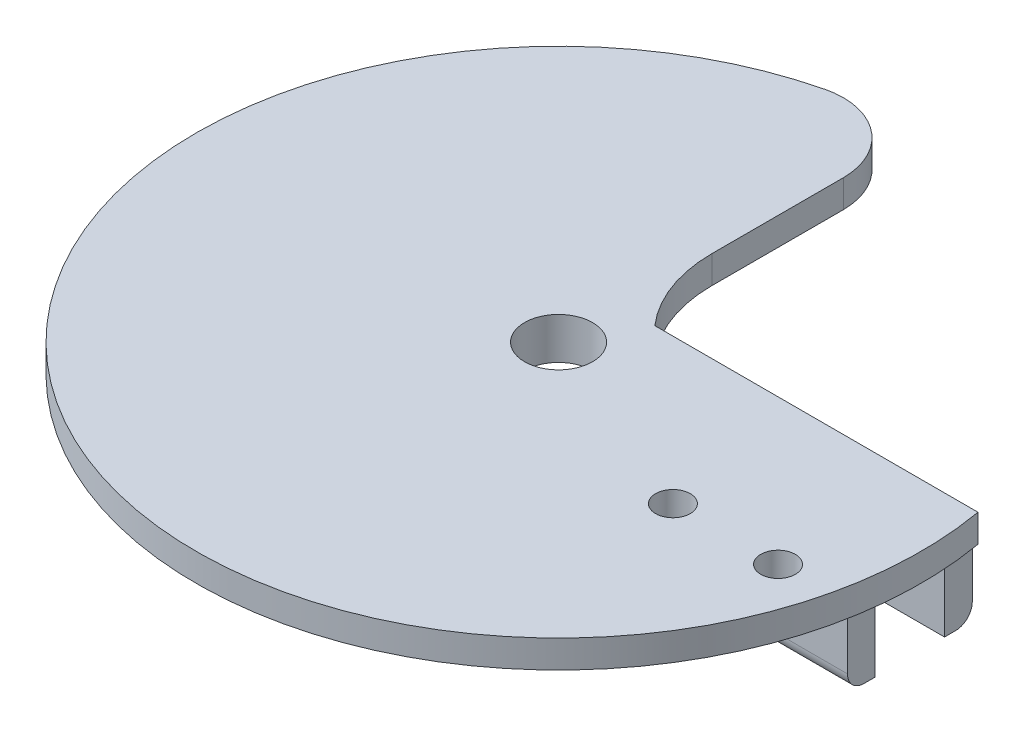
ISO-10303-21;
HEADER;
FILE_DESCRIPTION(('STEP AP214'),'2;1');
FILE_NAME('part.step','',(''),(''),'','','');
FILE_SCHEMA(('AUTOMOTIVE_DESIGN { 1 0 10303 214 1 1 1 1 }'));
ENDSEC;
DATA;
#1=APPLICATION_CONTEXT('core data for automotive mechanical design processes');
#2=APPLICATION_PROTOCOL_DEFINITION('international standard','automotive_design',2000,#1);
#3=PRODUCT_CONTEXT('',#1,'mechanical');
#4=PRODUCT('Part','Part','',(#3));
#5=PRODUCT_RELATED_PRODUCT_CATEGORY('part','',(#4));
#6=PRODUCT_DEFINITION_FORMATION('','',#4);
#7=PRODUCT_DEFINITION_CONTEXT('part definition',#1,'design');
#8=PRODUCT_DEFINITION('design','',#6,#7);
#9=PRODUCT_DEFINITION_SHAPE('','',#8);
#10=(LENGTH_UNIT() NAMED_UNIT(*) SI_UNIT(.MILLI.,.METRE.));
#11=(NAMED_UNIT(*) PLANE_ANGLE_UNIT() SI_UNIT($,.RADIAN.));
#12=(NAMED_UNIT(*) SI_UNIT($,.STERADIAN.) SOLID_ANGLE_UNIT());
#13=UNCERTAINTY_MEASURE_WITH_UNIT(LENGTH_MEASURE(1.E-05),#10,'distance_accuracy_value','');
#14=(GEOMETRIC_REPRESENTATION_CONTEXT(3) GLOBAL_UNCERTAINTY_ASSIGNED_CONTEXT((#13)) GLOBAL_UNIT_ASSIGNED_CONTEXT((#10,
#11,#12)) REPRESENTATION_CONTEXT('',''));
#15=CARTESIAN_POINT('',(0.,0.,0.));
#16=DIRECTION('',(0.,0.,1.));
#17=DIRECTION('',(1.,0.,0.));
#18=AXIS2_PLACEMENT_3D('',#15,#16,#17);
#19=CARTESIAN_POINT('',(0.,-2.,0.));
#20=DIRECTION('',(0.,1.,0.));
#21=DIRECTION('',(0.,0.,1.));
#22=AXIS2_PLACEMENT_3D('',#19,#20,#21);
#23=PLANE('',#22);
#24=DIRECTION('',(-1.,0.,0.));
#25=VECTOR('',#24,1.);
#26=CARTESIAN_POINT('',(0.,-2.,-4.5));
#27=LINE('',#26,#25);
#28=CARTESIAN_POINT('',(11.8896855897017,-2.,-4.5));
#29=VERTEX_POINT('',#28);
#30=CARTESIAN_POINT('',(2.44008444625373,-2.,-4.5));
#31=VERTEX_POINT('',#30);
#32=EDGE_CURVE('E270',#29,#31,#27,.T.);
#33=ORIENTED_EDGE('',*,*,#32,.F.);
#34=DIRECTION('',(0.,0.,1.));
#35=VECTOR('',#34,1.);
#36=CARTESIAN_POINT('',(11.8896855897017,-2.,0.));
#37=LINE('',#36,#35);
#38=CARTESIAN_POINT('',(11.8896855897017,-2.,-2.5));
#39=VERTEX_POINT('',#38);
#40=EDGE_CURVE('E305',#29,#39,#37,.T.);
#41=ORIENTED_EDGE('',*,*,#40,.T.);
#42=DIRECTION('',(1.,0.,0.));
#43=VECTOR('',#42,1.);
#44=CARTESIAN_POINT('',(0.,-2.,-2.5));
#45=LINE('',#44,#43);
#46=CARTESIAN_POINT('',(25.3293086999187,-2.,-2.5));
#47=VERTEX_POINT('',#46);
#48=EDGE_CURVE('E308',#39,#47,#45,.T.);
#49=ORIENTED_EDGE('',*,*,#48,.T.);
#50=DIRECTION('',(0.,0.,1.));
#51=VECTOR('',#50,1.);
#52=CARTESIAN_POINT('',(25.3293086999187,-2.,0.));
#53=LINE('',#52,#51);
#54=CARTESIAN_POINT('',(25.3293086999187,-2.,-4.5));
#55=VERTEX_POINT('',#54);
#56=EDGE_CURVE('E311',#55,#47,#53,.T.);
#57=ORIENTED_EDGE('',*,*,#56,.F.);
#58=CARTESIAN_POINT('',(25.7422891993278,-2.,-4.5));
#59=VERTEX_POINT('',#58);
#60=EDGE_CURVE('E272',#59,#55,#27,.T.);
#61=ORIENTED_EDGE('',*,*,#60,.F.);
#62=CARTESIAN_POINT('',(0.,-2.,0.));
#63=DIRECTION('',(0.,1.,0.));
#64=DIRECTION('',(0.,0.,1.));
#65=AXIS2_PLACEMENT_3D('',#62,#63,#64);
#66=CIRCLE('',#65,26.1326510944035);
#67=CARTESIAN_POINT('',(-6.18300349011207,-2.,-25.39066602244));
#68=VERTEX_POINT('',#67);
#69=EDGE_CURVE('E268',#68,#59,#66,.T.);
#70=ORIENTED_EDGE('',*,*,#69,.F.);
#71=CARTESIAN_POINT('',(-5.,-2.,-20.5326311581783));
#72=DIRECTION('',(0.,1.,0.));
#73=DIRECTION('',(0.,0.,1.));
#74=AXIS2_PLACEMENT_3D('',#71,#72,#73);
#75=CIRCLE('',#74,5.);
#76=CARTESIAN_POINT('',(0.,-2.,-20.5326311581783));
#77=VERTEX_POINT('',#76);
#78=EDGE_CURVE('E332',#68,#77,#75,.F.);
#79=ORIENTED_EDGE('',*,*,#78,.T.);
#80=DIRECTION('',(0.,0.,-1.));
#81=VECTOR('',#80,1.);
#82=CARTESIAN_POINT('',(0.,-2.,0.));
#83=LINE('',#82,#81);
#84=CARTESIAN_POINT('',(0.,-2.,-11.0458136866417));
#85=VERTEX_POINT('',#84);
#86=EDGE_CURVE('E275',#85,#77,#83,.T.);
#87=ORIENTED_EDGE('',*,*,#86,.F.);
#88=CARTESIAN_POINT('',(10.,-2.,-11.0458136866417));
#89=DIRECTION('',(0.,1.,0.));
#90=DIRECTION('',(0.,0.,1.));
#91=AXIS2_PLACEMENT_3D('',#88,#89,#90);
#92=CIRCLE('',#91,10.);
#93=EDGE_CURVE('E323',#85,#31,#92,.T.);
#94=ORIENTED_EDGE('',*,*,#93,.T.);
#95=EDGE_LOOP('',(#33,#41,#49,#57,#61,#70,#79,#87,#94));
#96=FACE_BOUND('',#95,.T.);
#97=CARTESIAN_POINT('',(0.,-2.,0.));
#98=DIRECTION('',(0.,1.,0.));
#99=DIRECTION('',(0.,0.,1.));
#100=AXIS2_PLACEMENT_3D('',#97,#98,#99);
#101=CIRCLE('',#100,4.9);
#102=CARTESIAN_POINT('',(3.28859060402685,-2.,-3.63251591037209));
#103=VERTEX_POINT('',#102);
#104=EDGE_CURVE('E300',#103,#103,#101,.T.);
#105=ORIENTED_EDGE('',*,*,#104,.T.);
#106=EDGE_LOOP('',(#105));
#107=FACE_BOUND('',#106,.T.);
#108=CARTESIAN_POINT('',(21.7862693163227,-2.,5.96189289697691));
#109=DIRECTION('',(0.,1.,0.));
#110=DIRECTION('',(0.,0.,1.));
#111=AXIS2_PLACEMENT_3D('',#108,#109,#110);
#112=CIRCLE('',#111,1.25);
#113=CARTESIAN_POINT('',(21.7862693163227,-2.,7.21189289697691));
#114=VERTEX_POINT('',#113);
#115=EDGE_CURVE('E278',#114,#114,#112,.T.);
#116=ORIENTED_EDGE('',*,*,#115,.T.);
#117=EDGE_LOOP('',(#116));
#118=FACE_BOUND('',#117,.T.);
#119=CARTESIAN_POINT('',(14.2060577810632,-2.,5.96189289697691));
#120=DIRECTION('',(0.,1.,0.));
#121=DIRECTION('',(0.,0.,1.));
#122=AXIS2_PLACEMENT_3D('',#119,#120,#121);
#123=CIRCLE('',#122,1.25);
#124=CARTESIAN_POINT('',(14.2060577810632,-2.,7.2118928969769));
#125=VERTEX_POINT('',#124);
#126=EDGE_CURVE('E281',#125,#125,#123,.T.);
#127=ORIENTED_EDGE('',*,*,#126,.T.);
#128=EDGE_LOOP('',(#127));
#129=FACE_BOUND('',#128,.T.);
#130=DIRECTION('',(0.,0.,1.));
#131=VECTOR('',#130,1.);
#132=CARTESIAN_POINT('',(25.3293086999187,-2.,0.));
#133=LINE('',#132,#131);
#134=CARTESIAN_POINT('',(25.3293086999187,-2.,2.5));
#135=VERTEX_POINT('',#134);
#136=CARTESIAN_POINT('',(25.3293086999187,-2.,4.5));
#137=VERTEX_POINT('',#136);
#138=EDGE_CURVE('E242',#135,#137,#133,.T.);
#139=ORIENTED_EDGE('',*,*,#138,.F.);
#140=DIRECTION('',(1.,0.,0.));
#141=VECTOR('',#140,1.);
#142=CARTESIAN_POINT('',(0.,-2.,2.5));
#143=LINE('',#142,#141);
#144=CARTESIAN_POINT('',(11.8896855897017,-2.,2.5));
#145=VERTEX_POINT('',#144);
#146=EDGE_CURVE('E219',#145,#135,#143,.T.);
#147=ORIENTED_EDGE('',*,*,#146,.F.);
#148=DIRECTION('',(0.,0.,1.));
#149=VECTOR('',#148,1.);
#150=CARTESIAN_POINT('',(11.8896855897017,-2.,0.));
#151=LINE('',#150,#149);
#152=CARTESIAN_POINT('',(11.8896855897017,-2.,4.5));
#153=VERTEX_POINT('',#152);
#154=EDGE_CURVE('E236',#145,#153,#151,.T.);
#155=ORIENTED_EDGE('',*,*,#154,.T.);
#156=DIRECTION('',(1.,0.,0.));
#157=VECTOR('',#156,1.);
#158=CARTESIAN_POINT('',(0.,-2.,4.5));
#159=LINE('',#158,#157);
#160=EDGE_CURVE('E239',#153,#137,#159,.T.);
#161=ORIENTED_EDGE('',*,*,#160,.T.);
#162=EDGE_LOOP('',(#139,#147,#155,#161));
#163=FACE_BOUND('',#162,.T.);
#164=ADVANCED_FACE('F95',(#96,#107,#118,#129,#163),#23,.F.);
#165=CARTESIAN_POINT('',(14.2060577810632,-2.,5.96189289697691));
#166=DIRECTION('',(0.,1.,0.));
#167=DIRECTION('',(0.,0.,1.));
#168=AXIS2_PLACEMENT_3D('',#165,#166,#167);
#169=CYLINDRICAL_SURFACE('',#168,1.25);
#170=ORIENTED_EDGE('',*,*,#126,.F.);
#171=EDGE_LOOP('',(#170));
#172=FACE_BOUND('',#171,.T.);
#173=CARTESIAN_POINT('',(14.2060577810632,0.,5.96189289697691));
#174=DIRECTION('',(0.,1.,0.));
#175=DIRECTION('',(0.,0.,1.));
#176=AXIS2_PLACEMENT_3D('',#173,#174,#175);
#177=CIRCLE('',#176,1.25);
#178=CARTESIAN_POINT('',(14.2060577810632,0.,7.2118928969769));
#179=VERTEX_POINT('',#178);
#180=EDGE_CURVE('E271',#179,#179,#177,.T.);
#181=ORIENTED_EDGE('',*,*,#180,.T.);
#182=EDGE_LOOP('',(#181));
#183=FACE_BOUND('',#182,.T.);
#184=ADVANCED_FACE('F412',(#172,#183),#169,.F.);
#185=CARTESIAN_POINT('',(21.7862693163227,-2.,5.96189289697691));
#186=DIRECTION('',(0.,1.,0.));
#187=DIRECTION('',(0.,0.,1.));
#188=AXIS2_PLACEMENT_3D('',#185,#186,#187);
#189=CYLINDRICAL_SURFACE('',#188,1.25);
#190=ORIENTED_EDGE('',*,*,#115,.F.);
#191=EDGE_LOOP('',(#190));
#192=FACE_BOUND('',#191,.T.);
#193=CARTESIAN_POINT('',(21.7862693163227,0.,5.96189289697691));
#194=DIRECTION('',(0.,1.,0.));
#195=DIRECTION('',(0.,0.,1.));
#196=AXIS2_PLACEMENT_3D('',#193,#194,#195);
#197=CIRCLE('',#196,1.25);
#198=CARTESIAN_POINT('',(21.7862693163227,0.,7.21189289697691));
#199=VERTEX_POINT('',#198);
#200=EDGE_CURVE('E293',#199,#199,#197,.T.);
#201=ORIENTED_EDGE('',*,*,#200,.T.);
#202=EDGE_LOOP('',(#201));
#203=FACE_BOUND('',#202,.T.);
#204=ADVANCED_FACE('F417',(#192,#203),#189,.F.);
#205=CARTESIAN_POINT('',(0.,-2.,0.));
#206=DIRECTION('',(1.,0.,0.));
#207=DIRECTION('',(0.,0.,-1.));
#208=AXIS2_PLACEMENT_3D('',#205,#206,#207);
#209=PLANE('',#208);
#210=ORIENTED_EDGE('',*,*,#86,.T.);
#211=DIRECTION('',(0.,1.,0.));
#212=VECTOR('',#211,1.);
#213=CARTESIAN_POINT('',(0.,-2.,-20.5326311581783));
#214=LINE('',#213,#212);
#215=CARTESIAN_POINT('',(0.,0.,-20.5326311581783));
#216=VERTEX_POINT('',#215);
#217=EDGE_CURVE('E325',#77,#216,#214,.T.);
#218=ORIENTED_EDGE('',*,*,#217,.T.);
#219=DIRECTION('',(0.,0.,-1.));
#220=VECTOR('',#219,1.);
#221=CARTESIAN_POINT('',(0.,0.,0.));
#222=LINE('',#221,#220);
#223=CARTESIAN_POINT('',(0.,0.,-11.0458136866417));
#224=VERTEX_POINT('',#223);
#225=EDGE_CURVE('E290',#224,#216,#222,.T.);
#226=ORIENTED_EDGE('',*,*,#225,.F.);
#227=DIRECTION('',(0.,-1.,0.));
#228=VECTOR('',#227,1.);
#229=CARTESIAN_POINT('',(0.,-2.,-11.0458136866417));
#230=LINE('',#229,#228);
#231=EDGE_CURVE('E318',#224,#85,#230,.T.);
#232=ORIENTED_EDGE('',*,*,#231,.T.);
#233=EDGE_LOOP('',(#210,#218,#226,#232));
#234=FACE_BOUND('',#233,.T.);
#235=ADVANCED_FACE('F378',(#234),#209,.T.);
#236=CARTESIAN_POINT('',(0.,-2.,-4.5));
#237=DIRECTION('',(0.,0.,-1.));
#238=DIRECTION('',(-1.,0.,0.));
#239=AXIS2_PLACEMENT_3D('',#236,#237,#238);
#240=PLANE('',#239);
#241=DIRECTION('',(0.,1.,0.));
#242=VECTOR('',#241,1.);
#243=CARTESIAN_POINT('',(25.3293086999187,-7.,-4.5));
#244=LINE('',#243,#242);
#245=CARTESIAN_POINT('',(25.3293086999187,-5.8,-4.5));
#246=VERTEX_POINT('',#245);
#247=EDGE_CURVE('E251',#246,#55,#244,.T.);
#248=ORIENTED_EDGE('',*,*,#247,.F.);
#249=DIRECTION('',(1.,0.,0.));
#250=VECTOR('',#249,1.);
#251=CARTESIAN_POINT('',(11.8896855897017,-5.8,-4.5));
#252=LINE('',#251,#250);
#253=CARTESIAN_POINT('',(11.8896855897017,-5.8,-4.5));
#254=VERTEX_POINT('',#253);
#255=EDGE_CURVE('E103',#246,#254,#252,.F.);
#256=ORIENTED_EDGE('',*,*,#255,.T.);
#257=DIRECTION('',(0.,1.,0.));
#258=VECTOR('',#257,1.);
#259=CARTESIAN_POINT('',(11.8896855897017,-7.,-4.5));
#260=LINE('',#259,#258);
#261=EDGE_CURVE('E259',#254,#29,#260,.T.);
#262=ORIENTED_EDGE('',*,*,#261,.T.);
#263=ORIENTED_EDGE('',*,*,#32,.T.);
#264=DIRECTION('',(0.,1.,0.));
#265=VECTOR('',#264,1.);
#266=CARTESIAN_POINT('',(2.44008444625373,-2.,-4.5));
#267=LINE('',#266,#265);
#268=CARTESIAN_POINT('',(2.44008444625373,0.,-4.5));
#269=VERTEX_POINT('',#268);
#270=EDGE_CURVE('E316',#31,#269,#267,.T.);
#271=ORIENTED_EDGE('',*,*,#270,.T.);
#272=DIRECTION('',(-1.,0.,0.));
#273=VECTOR('',#272,1.);
#274=CARTESIAN_POINT('',(0.,0.,-4.5));
#275=LINE('',#274,#273);
#276=CARTESIAN_POINT('',(25.7422891993278,0.,-4.5));
#277=VERTEX_POINT('',#276);
#278=EDGE_CURVE('E287',#277,#269,#275,.T.);
#279=ORIENTED_EDGE('',*,*,#278,.F.);
#280=DIRECTION('',(0.,1.,0.));
#281=VECTOR('',#280,1.);
#282=CARTESIAN_POINT('',(25.7422891993278,-2.,-4.5));
#283=LINE('',#282,#281);
#284=EDGE_CURVE('E284',#59,#277,#283,.T.);
#285=ORIENTED_EDGE('',*,*,#284,.F.);
#286=ORIENTED_EDGE('',*,*,#60,.T.);
#287=EDGE_LOOP('',(#248,#256,#262,#263,#271,#279,#285,#286));
#288=FACE_BOUND('',#287,.T.);
#289=ADVANCED_FACE('F367',(#288),#240,.T.);
#290=CARTESIAN_POINT('',(0.,-2.,0.));
#291=DIRECTION('',(0.,1.,0.));
#292=DIRECTION('',(0.,0.,1.));
#293=AXIS2_PLACEMENT_3D('',#290,#291,#292);
#294=CYLINDRICAL_SURFACE('',#293,26.1326510944035);
#295=CARTESIAN_POINT('',(0.,0.,0.));
#296=DIRECTION('',(0.,1.,0.));
#297=DIRECTION('',(0.,0.,1.));
#298=AXIS2_PLACEMENT_3D('',#295,#296,#297);
#299=CIRCLE('',#298,26.1326510944035);
#300=CARTESIAN_POINT('',(-6.18300349011207,0.,-25.39066602244));
#301=VERTEX_POINT('',#300);
#302=EDGE_CURVE('E285',#301,#277,#299,.T.);
#303=ORIENTED_EDGE('',*,*,#302,.F.);
#304=DIRECTION('',(0.,1.,0.));
#305=VECTOR('',#304,1.);
#306=CARTESIAN_POINT('',(-6.18300349011207,-2.,-25.39066602244));
#307=LINE('',#306,#305);
#308=EDGE_CURVE('E330',#301,#68,#307,.F.);
#309=ORIENTED_EDGE('',*,*,#308,.T.);
#310=ORIENTED_EDGE('',*,*,#69,.T.);
#311=ORIENTED_EDGE('',*,*,#284,.T.);
#312=EDGE_LOOP('',(#303,#309,#310,#311));
#313=FACE_BOUND('',#312,.T.);
#314=ADVANCED_FACE('F387',(#313),#294,.T.);
#315=CARTESIAN_POINT('',(0.,0.,0.));
#316=DIRECTION('',(0.,1.,0.));
#317=DIRECTION('',(0.,0.,1.));
#318=AXIS2_PLACEMENT_3D('',#315,#316,#317);
#319=PLANE('',#318);
#320=ORIENTED_EDGE('',*,*,#225,.T.);
#321=CARTESIAN_POINT('',(-5.,0.,-20.5326311581783));
#322=DIRECTION('',(0.,1.,0.));
#323=DIRECTION('',(0.,0.,1.));
#324=AXIS2_PLACEMENT_3D('',#321,#322,#323);
#325=CIRCLE('',#324,5.);
#326=EDGE_CURVE('E328',#216,#301,#325,.T.);
#327=ORIENTED_EDGE('',*,*,#326,.T.);
#328=ORIENTED_EDGE('',*,*,#302,.T.);
#329=ORIENTED_EDGE('',*,*,#278,.T.);
#330=CARTESIAN_POINT('',(10.,0.,-11.0458136866417));
#331=DIRECTION('',(0.,1.,0.));
#332=DIRECTION('',(0.,0.,1.));
#333=AXIS2_PLACEMENT_3D('',#330,#331,#332);
#334=CIRCLE('',#333,10.);
#335=EDGE_CURVE('E321',#269,#224,#334,.F.);
#336=ORIENTED_EDGE('',*,*,#335,.T.);
#337=EDGE_LOOP('',(#320,#327,#328,#329,#336));
#338=FACE_BOUND('',#337,.T.);
#339=ORIENTED_EDGE('',*,*,#200,.F.);
#340=EDGE_LOOP('',(#339));
#341=FACE_BOUND('',#340,.T.);
#342=ORIENTED_EDGE('',*,*,#180,.F.);
#343=EDGE_LOOP('',(#342));
#344=FACE_BOUND('',#343,.T.);
#345=CARTESIAN_POINT('',(0.,0.,0.));
#346=DIRECTION('',(0.,1.,0.));
#347=DIRECTION('',(0.,0.,1.));
#348=AXIS2_PLACEMENT_3D('',#345,#346,#347);
#349=CIRCLE('',#348,2.45);
#350=CARTESIAN_POINT('',(0.,0.,2.45));
#351=VERTEX_POINT('',#350);
#352=EDGE_CURVE('E267',#351,#351,#349,.T.);
#353=ORIENTED_EDGE('',*,*,#352,.F.);
#354=EDGE_LOOP('',(#353));
#355=FACE_BOUND('',#354,.T.);
#356=ADVANCED_FACE('F375',(#338,#341,#344,#355),#319,.T.);
#357=CARTESIAN_POINT('',(0.,-2.,0.));
#358=DIRECTION('',(0.,1.,0.));
#359=DIRECTION('',(0.,0.,1.));
#360=AXIS2_PLACEMENT_3D('',#357,#358,#359);
#361=CYLINDRICAL_SURFACE('',#360,4.9);
#362=ORIENTED_EDGE('',*,*,#104,.F.);
#363=EDGE_LOOP('',(#362));
#364=FACE_BOUND('',#363,.T.);
#365=CARTESIAN_POINT('',(0.,-3.,0.));
#366=DIRECTION('',(0.,1.,0.));
#367=DIRECTION('',(0.,0.,1.));
#368=AXIS2_PLACEMENT_3D('',#365,#366,#367);
#369=CIRCLE('',#368,4.9);
#370=CARTESIAN_POINT('',(0.,-3.,4.9));
#371=VERTEX_POINT('',#370);
#372=EDGE_CURVE('E255',#371,#371,#369,.T.);
#373=ORIENTED_EDGE('',*,*,#372,.T.);
#374=EDGE_LOOP('',(#373));
#375=FACE_BOUND('',#374,.T.);
#376=ADVANCED_FACE('F392',(#364,#375),#361,.T.);
#377=CARTESIAN_POINT('',(0.,-2.,0.));
#378=DIRECTION('',(0.,1.,0.));
#379=DIRECTION('',(0.,0.,1.));
#380=AXIS2_PLACEMENT_3D('',#377,#378,#379);
#381=CYLINDRICAL_SURFACE('',#380,2.45);
#382=ORIENTED_EDGE('',*,*,#352,.T.);
#383=EDGE_LOOP('',(#382));
#384=FACE_BOUND('',#383,.T.);
#385=CARTESIAN_POINT('',(0.,-3.,0.));
#386=DIRECTION('',(0.,1.,0.));
#387=DIRECTION('',(0.,0.,1.));
#388=AXIS2_PLACEMENT_3D('',#385,#386,#387);
#389=CIRCLE('',#388,2.45);
#390=CARTESIAN_POINT('',(0.,-3.,2.45));
#391=VERTEX_POINT('',#390);
#392=EDGE_CURVE('E264',#391,#391,#389,.T.);
#393=ORIENTED_EDGE('',*,*,#392,.F.);
#394=EDGE_LOOP('',(#393));
#395=FACE_BOUND('',#394,.T.);
#396=ADVANCED_FACE('F395',(#384,#395),#381,.F.);
#397=CARTESIAN_POINT('',(0.,-3.,0.));
#398=DIRECTION('',(0.,1.,0.));
#399=DIRECTION('',(0.,0.,1.));
#400=AXIS2_PLACEMENT_3D('',#397,#398,#399);
#401=PLANE('',#400);
#402=ORIENTED_EDGE('',*,*,#372,.F.);
#403=EDGE_LOOP('',(#402));
#404=FACE_BOUND('',#403,.T.);
#405=ORIENTED_EDGE('',*,*,#392,.T.);
#406=EDGE_LOOP('',(#405));
#407=FACE_BOUND('',#406,.T.);
#408=ADVANCED_FACE('F399',(#404,#407),#401,.F.);
#409=CARTESIAN_POINT('',(25.3293086999187,-7.,0.));
#410=DIRECTION('',(-1.,0.,0.));
#411=DIRECTION('',(0.,0.,1.));
#412=AXIS2_PLACEMENT_3D('',#409,#410,#411);
#413=PLANE('',#412);
#414=DIRECTION('',(0.,0.,1.));
#415=VECTOR('',#414,1.);
#416=CARTESIAN_POINT('',(25.3293086999187,-7.,0.));
#417=LINE('',#416,#415);
#418=CARTESIAN_POINT('',(25.3293086999187,-7.,-3.3));
#419=VERTEX_POINT('',#418);
#420=CARTESIAN_POINT('',(25.3293086999187,-7.,-2.5));
#421=VERTEX_POINT('',#420);
#422=EDGE_CURVE('E244',#419,#421,#417,.T.);
#423=ORIENTED_EDGE('',*,*,#422,.F.);
#424=CARTESIAN_POINT('',(25.3293086999187,-5.8,-3.3));
#425=DIRECTION('',(-1.,0.,0.));
#426=DIRECTION('',(0.,0.,1.));
#427=AXIS2_PLACEMENT_3D('',#424,#425,#426);
#428=CIRCLE('',#427,1.2);
#429=EDGE_CURVE('E117',#419,#246,#428,.F.);
#430=ORIENTED_EDGE('',*,*,#429,.T.);
#431=ORIENTED_EDGE('',*,*,#247,.T.);
#432=ORIENTED_EDGE('',*,*,#56,.T.);
#433=DIRECTION('',(0.,1.,0.));
#434=VECTOR('',#433,1.);
#435=CARTESIAN_POINT('',(25.3293086999187,-7.,-2.5));
#436=LINE('',#435,#434);
#437=EDGE_CURVE('E252',#421,#47,#436,.T.);
#438=ORIENTED_EDGE('',*,*,#437,.F.);
#439=EDGE_LOOP('',(#423,#430,#431,#432,#438));
#440=FACE_BOUND('',#439,.T.);
#441=ADVANCED_FACE('F353',(#440),#413,.F.);
#442=CARTESIAN_POINT('',(0.,-7.,-2.5));
#443=DIRECTION('',(0.,0.,1.));
#444=DIRECTION('',(1.,0.,0.));
#445=AXIS2_PLACEMENT_3D('',#442,#443,#444);
#446=PLANE('',#445);
#447=ORIENTED_EDGE('',*,*,#48,.F.);
#448=DIRECTION('',(0.,1.,0.));
#449=VECTOR('',#448,1.);
#450=CARTESIAN_POINT('',(11.8896855897017,-7.,-2.5));
#451=LINE('',#450,#449);
#452=CARTESIAN_POINT('',(11.8896855897017,-7.,-2.5));
#453=VERTEX_POINT('',#452);
#454=EDGE_CURVE('E256',#453,#39,#451,.T.);
#455=ORIENTED_EDGE('',*,*,#454,.F.);
#456=DIRECTION('',(1.,0.,0.));
#457=VECTOR('',#456,1.);
#458=CARTESIAN_POINT('',(0.,-7.,-2.5));
#459=LINE('',#458,#457);
#460=EDGE_CURVE('E248',#453,#421,#459,.T.);
#461=ORIENTED_EDGE('',*,*,#460,.T.);
#462=ORIENTED_EDGE('',*,*,#437,.T.);
#463=EDGE_LOOP('',(#447,#455,#461,#462));
#464=FACE_BOUND('',#463,.T.);
#465=ADVANCED_FACE('F357',(#464),#446,.T.);
#466=CARTESIAN_POINT('',(11.8896855897017,-7.,0.));
#467=DIRECTION('',(-1.,0.,0.));
#468=DIRECTION('',(0.,0.,1.));
#469=AXIS2_PLACEMENT_3D('',#466,#467,#468);
#470=PLANE('',#469);
#471=ORIENTED_EDGE('',*,*,#261,.F.);
#472=CARTESIAN_POINT('',(11.8896855897017,-5.8,-3.3));
#473=DIRECTION('',(-1.,0.,0.));
#474=DIRECTION('',(0.,0.,1.));
#475=AXIS2_PLACEMENT_3D('',#472,#473,#474);
#476=CIRCLE('',#475,1.2);
#477=CARTESIAN_POINT('',(11.8896855897017,-7.,-3.3));
#478=VERTEX_POINT('',#477);
#479=EDGE_CURVE('E12',#254,#478,#476,.T.);
#480=ORIENTED_EDGE('',*,*,#479,.T.);
#481=DIRECTION('',(0.,0.,1.));
#482=VECTOR('',#481,1.);
#483=CARTESIAN_POINT('',(11.8896855897017,-7.,0.));
#484=LINE('',#483,#482);
#485=EDGE_CURVE('E246',#478,#453,#484,.T.);
#486=ORIENTED_EDGE('',*,*,#485,.T.);
#487=ORIENTED_EDGE('',*,*,#454,.T.);
#488=ORIENTED_EDGE('',*,*,#40,.F.);
#489=EDGE_LOOP('',(#471,#480,#486,#487,#488));
#490=FACE_BOUND('',#489,.T.);
#491=ADVANCED_FACE('F360',(#490),#470,.T.);
#492=CARTESIAN_POINT('',(0.,-7.,0.));
#493=DIRECTION('',(0.,1.,0.));
#494=DIRECTION('',(0.,0.,1.));
#495=AXIS2_PLACEMENT_3D('',#492,#493,#494);
#496=PLANE('',#495);
#497=ORIENTED_EDGE('',*,*,#485,.F.);
#498=DIRECTION('',(1.,0.,0.));
#499=VECTOR('',#498,1.);
#500=CARTESIAN_POINT('',(25.3293086999187,-7.,-3.3));
#501=LINE('',#500,#499);
#502=EDGE_CURVE('E342',#478,#419,#501,.T.);
#503=ORIENTED_EDGE('',*,*,#502,.T.);
#504=ORIENTED_EDGE('',*,*,#422,.T.);
#505=ORIENTED_EDGE('',*,*,#460,.F.);
#506=EDGE_LOOP('',(#497,#503,#504,#505));
#507=FACE_BOUND('',#506,.T.);
#508=ADVANCED_FACE('F348',(#507),#496,.F.);
#509=CARTESIAN_POINT('',(25.3293086999187,-7.,0.));
#510=DIRECTION('',(-1.,0.,0.));
#511=DIRECTION('',(0.,0.,1.));
#512=AXIS2_PLACEMENT_3D('',#509,#510,#511);
#513=PLANE('',#512);
#514=DIRECTION('',(0.,1.,0.));
#515=VECTOR('',#514,1.);
#516=CARTESIAN_POINT('',(25.3293086999187,-7.,4.5));
#517=LINE('',#516,#515);
#518=CARTESIAN_POINT('',(25.3293086999187,-5.8,4.5));
#519=VERTEX_POINT('',#518);
#520=EDGE_CURVE('E230',#519,#137,#517,.T.);
#521=ORIENTED_EDGE('',*,*,#520,.F.);
#522=CARTESIAN_POINT('',(25.3293086999187,-5.8,3.3));
#523=DIRECTION('',(-1.,0.,0.));
#524=DIRECTION('',(0.,0.,1.));
#525=AXIS2_PLACEMENT_3D('',#522,#523,#524);
#526=CIRCLE('',#525,1.2);
#527=CARTESIAN_POINT('',(25.3293086999187,-7.,3.3));
#528=VERTEX_POINT('',#527);
#529=EDGE_CURVE('E226',#519,#528,#526,.F.);
#530=ORIENTED_EDGE('',*,*,#529,.T.);
#531=DIRECTION('',(0.,0.,1.));
#532=VECTOR('',#531,1.);
#533=CARTESIAN_POINT('',(25.3293086999187,-7.,0.));
#534=LINE('',#533,#532);
#535=CARTESIAN_POINT('',(25.3293086999187,-7.,2.5));
#536=VERTEX_POINT('',#535);
#537=EDGE_CURVE('E208',#536,#528,#534,.T.);
#538=ORIENTED_EDGE('',*,*,#537,.F.);
#539=DIRECTION('',(0.,1.,0.));
#540=VECTOR('',#539,1.);
#541=CARTESIAN_POINT('',(25.3293086999187,-7.,2.5));
#542=LINE('',#541,#540);
#543=EDGE_CURVE('E217',#536,#135,#542,.T.);
#544=ORIENTED_EDGE('',*,*,#543,.T.);
#545=ORIENTED_EDGE('',*,*,#138,.T.);
#546=EDGE_LOOP('',(#521,#530,#538,#544,#545));
#547=FACE_BOUND('',#546,.T.);
#548=ADVANCED_FACE('F225',(#547),#513,.F.);
#549=CARTESIAN_POINT('',(0.,-7.,4.5));
#550=DIRECTION('',(0.,0.,1.));
#551=DIRECTION('',(1.,0.,0.));
#552=AXIS2_PLACEMENT_3D('',#549,#550,#551);
#553=PLANE('',#552);
#554=DIRECTION('',(0.,1.,0.));
#555=VECTOR('',#554,1.);
#556=CARTESIAN_POINT('',(11.8896855897017,-7.,4.5));
#557=LINE('',#556,#555);
#558=CARTESIAN_POINT('',(11.8896855897017,-5.8,4.5));
#559=VERTEX_POINT('',#558);
#560=EDGE_CURVE('E232',#559,#153,#557,.T.);
#561=ORIENTED_EDGE('',*,*,#560,.F.);
#562=DIRECTION('',(1.,0.,0.));
#563=VECTOR('',#562,1.);
#564=CARTESIAN_POINT('',(25.3293086999187,-5.8,4.5));
#565=LINE('',#564,#563);
#566=EDGE_CURVE('E334',#559,#519,#565,.T.);
#567=ORIENTED_EDGE('',*,*,#566,.T.);
#568=ORIENTED_EDGE('',*,*,#520,.T.);
#569=ORIENTED_EDGE('',*,*,#160,.F.);
#570=EDGE_LOOP('',(#561,#567,#568,#569));
#571=FACE_BOUND('',#570,.T.);
#572=ADVANCED_FACE('F531',(#571),#553,.T.);
#573=CARTESIAN_POINT('',(11.8896855897017,-7.,0.));
#574=DIRECTION('',(-1.,0.,0.));
#575=DIRECTION('',(0.,0.,1.));
#576=AXIS2_PLACEMENT_3D('',#573,#574,#575);
#577=PLANE('',#576);
#578=DIRECTION('',(0.,0.,1.));
#579=VECTOR('',#578,1.);
#580=CARTESIAN_POINT('',(11.8896855897017,-7.,0.));
#581=LINE('',#580,#579);
#582=CARTESIAN_POINT('',(11.8896855897017,-7.,2.5));
#583=VERTEX_POINT('',#582);
#584=CARTESIAN_POINT('',(11.8896855897017,-7.,3.3));
#585=VERTEX_POINT('',#584);
#586=EDGE_CURVE('E211',#583,#585,#581,.T.);
#587=ORIENTED_EDGE('',*,*,#586,.T.);
#588=CARTESIAN_POINT('',(11.8896855897017,-5.8,3.3));
#589=DIRECTION('',(-1.,0.,0.));
#590=DIRECTION('',(0.,0.,1.));
#591=AXIS2_PLACEMENT_3D('',#588,#589,#590);
#592=CIRCLE('',#591,1.2);
#593=EDGE_CURVE('E340',#585,#559,#592,.T.);
#594=ORIENTED_EDGE('',*,*,#593,.T.);
#595=ORIENTED_EDGE('',*,*,#560,.T.);
#596=ORIENTED_EDGE('',*,*,#154,.F.);
#597=DIRECTION('',(0.,1.,0.));
#598=VECTOR('',#597,1.);
#599=CARTESIAN_POINT('',(11.8896855897017,-7.,2.5));
#600=LINE('',#599,#598);
#601=EDGE_CURVE('E222',#583,#145,#600,.T.);
#602=ORIENTED_EDGE('',*,*,#601,.F.);
#603=EDGE_LOOP('',(#587,#594,#595,#596,#602));
#604=FACE_BOUND('',#603,.T.);
#605=ADVANCED_FACE('F538',(#604),#577,.T.);
#606=CARTESIAN_POINT('',(0.,-7.,2.5));
#607=DIRECTION('',(0.,0.,1.));
#608=DIRECTION('',(1.,0.,0.));
#609=AXIS2_PLACEMENT_3D('',#606,#607,#608);
#610=PLANE('',#609);
#611=ORIENTED_EDGE('',*,*,#601,.T.);
#612=ORIENTED_EDGE('',*,*,#146,.T.);
#613=ORIENTED_EDGE('',*,*,#543,.F.);
#614=DIRECTION('',(1.,0.,0.));
#615=VECTOR('',#614,1.);
#616=CARTESIAN_POINT('',(0.,-7.,2.5));
#617=LINE('',#616,#615);
#618=EDGE_CURVE('E204',#583,#536,#617,.T.);
#619=ORIENTED_EDGE('',*,*,#618,.F.);
#620=EDGE_LOOP('',(#611,#612,#613,#619));
#621=FACE_BOUND('',#620,.T.);
#622=ADVANCED_FACE('F218',(#621),#610,.F.);
#623=CARTESIAN_POINT('',(0.,-7.,0.));
#624=DIRECTION('',(0.,1.,0.));
#625=DIRECTION('',(0.,0.,1.));
#626=AXIS2_PLACEMENT_3D('',#623,#624,#625);
#627=PLANE('',#626);
#628=ORIENTED_EDGE('',*,*,#537,.T.);
#629=DIRECTION('',(1.,0.,0.));
#630=VECTOR('',#629,1.);
#631=CARTESIAN_POINT('',(11.8896855897017,-7.,3.3));
#632=LINE('',#631,#630);
#633=EDGE_CURVE('E338',#528,#585,#632,.F.);
#634=ORIENTED_EDGE('',*,*,#633,.T.);
#635=ORIENTED_EDGE('',*,*,#586,.F.);
#636=ORIENTED_EDGE('',*,*,#618,.T.);
#637=EDGE_LOOP('',(#628,#634,#635,#636));
#638=FACE_BOUND('',#637,.T.);
#639=ADVANCED_FACE('F206',(#638),#627,.F.);
#640=CARTESIAN_POINT('',(10.,-2.,-11.0458136866417));
#641=DIRECTION('',(0.,1.,0.));
#642=DIRECTION('',(0.,0.,1.));
#643=AXIS2_PLACEMENT_3D('',#640,#641,#642);
#644=CYLINDRICAL_SURFACE('',#643,10.);
#645=ORIENTED_EDGE('',*,*,#93,.F.);
#646=ORIENTED_EDGE('',*,*,#231,.F.);
#647=ORIENTED_EDGE('',*,*,#335,.F.);
#648=ORIENTED_EDGE('',*,*,#270,.F.);
#649=EDGE_LOOP('',(#645,#646,#647,#648));
#650=FACE_BOUND('',#649,.T.);
#651=ADVANCED_FACE('F371',(#650),#644,.F.);
#652=CARTESIAN_POINT('',(-5.,-2.,-20.5326311581783));
#653=DIRECTION('',(0.,1.,0.));
#654=DIRECTION('',(0.,0.,1.));
#655=AXIS2_PLACEMENT_3D('',#652,#653,#654);
#656=CYLINDRICAL_SURFACE('',#655,5.);
#657=ORIENTED_EDGE('',*,*,#78,.F.);
#658=ORIENTED_EDGE('',*,*,#308,.F.);
#659=ORIENTED_EDGE('',*,*,#326,.F.);
#660=ORIENTED_EDGE('',*,*,#217,.F.);
#661=EDGE_LOOP('',(#657,#658,#659,#660));
#662=FACE_BOUND('',#661,.T.);
#663=ADVANCED_FACE('F383',(#662),#656,.T.);
#664=CARTESIAN_POINT('',(0.,-5.8,3.3));
#665=DIRECTION('',(-1.,0.,0.));
#666=DIRECTION('',(0.,0.,1.));
#667=AXIS2_PLACEMENT_3D('',#664,#665,#666);
#668=CYLINDRICAL_SURFACE('',#667,1.2);
#669=ORIENTED_EDGE('',*,*,#593,.F.);
#670=ORIENTED_EDGE('',*,*,#633,.F.);
#671=ORIENTED_EDGE('',*,*,#529,.F.);
#672=ORIENTED_EDGE('',*,*,#566,.F.);
#673=EDGE_LOOP('',(#669,#670,#671,#672));
#674=FACE_BOUND('',#673,.T.);
#675=ADVANCED_FACE('F558',(#674),#668,.T.);
#676=CARTESIAN_POINT('',(0.,-5.8,-3.3));
#677=DIRECTION('',(-1.,0.,0.));
#678=DIRECTION('',(0.,0.,1.));
#679=AXIS2_PLACEMENT_3D('',#676,#677,#678);
#680=CYLINDRICAL_SURFACE('',#679,1.2);
#681=ORIENTED_EDGE('',*,*,#479,.F.);
#682=ORIENTED_EDGE('',*,*,#255,.F.);
#683=ORIENTED_EDGE('',*,*,#429,.F.);
#684=ORIENTED_EDGE('',*,*,#502,.F.);
#685=EDGE_LOOP('',(#681,#682,#683,#684));
#686=FACE_BOUND('',#685,.T.);
#687=ADVANCED_FACE('F97',(#686),#680,.T.);
#688=CLOSED_SHELL('',(#164,#184,#204,#235,#289,#314,#356,#376,#396,#408,#441,#465,#491,#508,
#548,#572,#605,#622,#639,#651,#663,#675,#687));
#689=MANIFOLD_SOLID_BREP('B2',#688);
#690=ADVANCED_BREP_SHAPE_REPRESENTATION('',(#18,#689),#14);
#691=SHAPE_DEFINITION_REPRESENTATION(#9,#690);
ENDSEC;
END-ISO-10303-21;
